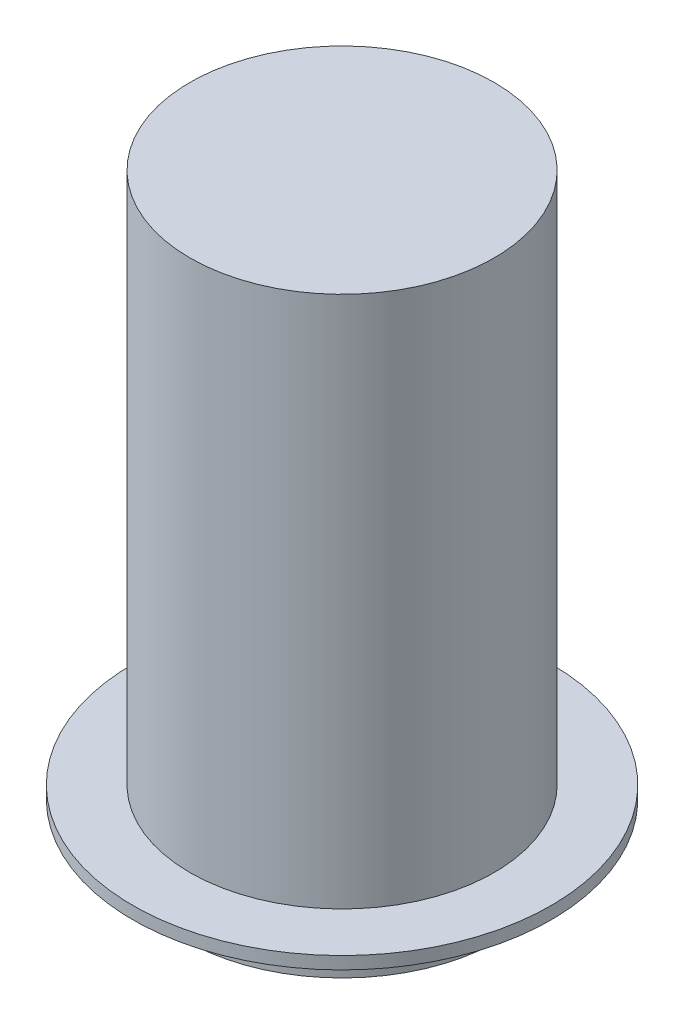
ISO-10303-21;
HEADER;
FILE_DESCRIPTION(('STEP AP214'),'2;1');
FILE_NAME('part.step','',(''),(''),'','','');
FILE_SCHEMA(('AUTOMOTIVE_DESIGN { 1 0 10303 214 1 1 1 1 }'));
ENDSEC;
DATA;
#1=APPLICATION_CONTEXT('core data for automotive mechanical design processes');
#2=APPLICATION_PROTOCOL_DEFINITION('international standard','automotive_design',2000,#1);
#3=PRODUCT_CONTEXT('',#1,'mechanical');
#4=PRODUCT('Part','Part','',(#3));
#5=PRODUCT_RELATED_PRODUCT_CATEGORY('part','',(#4));
#6=PRODUCT_DEFINITION_FORMATION('','',#4);
#7=PRODUCT_DEFINITION_CONTEXT('part definition',#1,'design');
#8=PRODUCT_DEFINITION('design','',#6,#7);
#9=PRODUCT_DEFINITION_SHAPE('','',#8);
#10=(LENGTH_UNIT() NAMED_UNIT(*) SI_UNIT(.MILLI.,.METRE.));
#11=(NAMED_UNIT(*) PLANE_ANGLE_UNIT() SI_UNIT($,.RADIAN.));
#12=(NAMED_UNIT(*) SI_UNIT($,.STERADIAN.) SOLID_ANGLE_UNIT());
#13=UNCERTAINTY_MEASURE_WITH_UNIT(LENGTH_MEASURE(1.E-05),#10,'distance_accuracy_value','');
#14=(GEOMETRIC_REPRESENTATION_CONTEXT(3) GLOBAL_UNCERTAINTY_ASSIGNED_CONTEXT((#13)) GLOBAL_UNIT_ASSIGNED_CONTEXT((#10,
#11,#12)) REPRESENTATION_CONTEXT('',''));
#15=CARTESIAN_POINT('',(0.,0.,0.));
#16=DIRECTION('',(0.,0.,1.));
#17=DIRECTION('',(1.,0.,0.));
#18=AXIS2_PLACEMENT_3D('',#15,#16,#17);
#19=CARTESIAN_POINT('',(0.,35.82,0.));
#20=DIRECTION('',(0.,1.,0.));
#21=DIRECTION('',(0.,0.,1.));
#22=AXIS2_PLACEMENT_3D('',#19,#20,#21);
#23=PLANE('',#22);
#24=CARTESIAN_POINT('',(0.,35.82,0.));
#25=DIRECTION('',(0.,-1.,0.));
#26=DIRECTION('',(0.,0.,-1.));
#27=AXIS2_PLACEMENT_3D('',#24,#25,#26);
#28=CIRCLE('',#27,10.);
#29=CARTESIAN_POINT('',(0.,35.82,-10.));
#30=VERTEX_POINT('',#29);
#31=EDGE_CURVE('E10',#30,#30,#28,.T.);
#32=ORIENTED_EDGE('',*,*,#31,.F.);
#33=EDGE_LOOP('',(#32));
#34=FACE_BOUND('',#33,.T.);
#35=ADVANCED_FACE('F35',(#34),#23,.T.);
#36=CARTESIAN_POINT('',(0.,0.,0.));
#37=DIRECTION('',(0.,-1.,0.));
#38=DIRECTION('',(0.,0.,-1.));
#39=AXIS2_PLACEMENT_3D('',#36,#37,#38);
#40=CYLINDRICAL_SURFACE('',#39,10.);
#41=ORIENTED_EDGE('',*,*,#31,.T.);
#42=EDGE_LOOP('',(#41));
#43=FACE_BOUND('',#42,.T.);
#44=CARTESIAN_POINT('',(0.,0.820000000000001,0.));
#45=DIRECTION('',(0.,-1.,0.));
#46=DIRECTION('',(0.,0.,-1.));
#47=AXIS2_PLACEMENT_3D('',#44,#45,#46);
#48=CIRCLE('',#47,10.);
#49=CARTESIAN_POINT('',(0.,0.820000000000001,-10.));
#50=VERTEX_POINT('',#49);
#51=EDGE_CURVE('E41',#50,#50,#48,.T.);
#52=ORIENTED_EDGE('',*,*,#51,.F.);
#53=EDGE_LOOP('',(#52));
#54=FACE_BOUND('',#53,.T.);
#55=ADVANCED_FACE('F83',(#43,#54),#40,.T.);
#56=CARTESIAN_POINT('',(10.,0.82,0.));
#57=DIRECTION('',(0.,1.,0.));
#58=DIRECTION('',(0.,0.,1.));
#59=AXIS2_PLACEMENT_3D('',#56,#57,#58);
#60=PLANE('',#59);
#61=ORIENTED_EDGE('',*,*,#51,.T.);
#62=EDGE_LOOP('',(#61));
#63=FACE_BOUND('',#62,.T.);
#64=CARTESIAN_POINT('',(0.,0.82,0.));
#65=DIRECTION('',(0.,-1.,0.));
#66=DIRECTION('',(0.,0.,-1.));
#67=AXIS2_PLACEMENT_3D('',#64,#65,#66);
#68=CIRCLE('',#67,13.75);
#69=CARTESIAN_POINT('',(0.,0.82,-13.75));
#70=VERTEX_POINT('',#69);
#71=EDGE_CURVE('E45',#70,#70,#68,.T.);
#72=ORIENTED_EDGE('',*,*,#71,.F.);
#73=EDGE_LOOP('',(#72));
#74=FACE_BOUND('',#73,.T.);
#75=ADVANCED_FACE('F88',(#63,#74),#60,.T.);
#76=CARTESIAN_POINT('',(0.,0.,0.));
#77=DIRECTION('',(0.,-1.,0.));
#78=DIRECTION('',(0.,0.,-1.));
#79=AXIS2_PLACEMENT_3D('',#76,#77,#78);
#80=CYLINDRICAL_SURFACE('',#79,13.75);
#81=ORIENTED_EDGE('',*,*,#71,.T.);
#82=EDGE_LOOP('',(#81));
#83=FACE_BOUND('',#82,.T.);
#84=CARTESIAN_POINT('',(0.,0.,0.));
#85=DIRECTION('',(0.,-1.,0.));
#86=DIRECTION('',(0.,0.,-1.));
#87=AXIS2_PLACEMENT_3D('',#84,#85,#86);
#88=CIRCLE('',#87,13.75);
#89=CARTESIAN_POINT('',(0.,0.,-13.75));
#90=VERTEX_POINT('',#89);
#91=EDGE_CURVE('E49',#90,#90,#88,.T.);
#92=ORIENTED_EDGE('',*,*,#91,.F.);
#93=EDGE_LOOP('',(#92));
#94=FACE_BOUND('',#93,.T.);
#95=ADVANCED_FACE('F92',(#83,#94),#80,.T.);
#96=CARTESIAN_POINT('',(13.75,0.,0.));
#97=DIRECTION('',(0.,-1.,0.));
#98=DIRECTION('',(0.,0.,-1.));
#99=AXIS2_PLACEMENT_3D('',#96,#97,#98);
#100=PLANE('',#99);
#101=ORIENTED_EDGE('',*,*,#91,.T.);
#102=EDGE_LOOP('',(#101));
#103=FACE_BOUND('',#102,.T.);
#104=CARTESIAN_POINT('',(0.,0.,0.));
#105=DIRECTION('',(0.,-1.,0.));
#106=DIRECTION('',(0.,0.,-1.));
#107=AXIS2_PLACEMENT_3D('',#104,#105,#106);
#108=CIRCLE('',#107,10.325);
#109=CARTESIAN_POINT('',(0.,0.,-10.325));
#110=VERTEX_POINT('',#109);
#111=EDGE_CURVE('E54',#110,#110,#108,.T.);
#112=ORIENTED_EDGE('',*,*,#111,.F.);
#113=EDGE_LOOP('',(#112));
#114=FACE_BOUND('',#113,.T.);
#115=ADVANCED_FACE('F98',(#103,#114),#100,.T.);
#116=CARTESIAN_POINT('',(0.,0.,0.));
#117=DIRECTION('',(0.,-1.,0.));
#118=DIRECTION('',(0.,0.,-1.));
#119=AXIS2_PLACEMENT_3D('',#116,#117,#118);
#120=CYLINDRICAL_SURFACE('',#119,10.325);
#121=ORIENTED_EDGE('',*,*,#111,.T.);
#122=EDGE_LOOP('',(#121));
#123=FACE_BOUND('',#122,.T.);
#124=CARTESIAN_POINT('',(0.,-2.88,0.));
#125=DIRECTION('',(0.,-1.,0.));
#126=DIRECTION('',(0.,0.,-1.));
#127=AXIS2_PLACEMENT_3D('',#124,#125,#126);
#128=CIRCLE('',#127,10.325);
#129=CARTESIAN_POINT('',(0.,-2.88,-10.325));
#130=VERTEX_POINT('',#129);
#131=EDGE_CURVE('E57',#130,#130,#128,.T.);
#132=ORIENTED_EDGE('',*,*,#131,.F.);
#133=EDGE_LOOP('',(#132));
#134=FACE_BOUND('',#133,.T.);
#135=ADVANCED_FACE('F79',(#123,#134),#120,.T.);
#136=CARTESIAN_POINT('',(10.325,-2.88,0.));
#137=DIRECTION('',(0.,-1.,0.));
#138=DIRECTION('',(0.,0.,-1.));
#139=AXIS2_PLACEMENT_3D('',#136,#137,#138);
#140=PLANE('',#139);
#141=ORIENTED_EDGE('',*,*,#131,.T.);
#142=EDGE_LOOP('',(#141));
#143=FACE_BOUND('',#142,.T.);
#144=CARTESIAN_POINT('',(0.,-2.88,0.));
#145=DIRECTION('',(0.,-1.,0.));
#146=DIRECTION('',(0.,0.,-1.));
#147=AXIS2_PLACEMENT_3D('',#144,#145,#146);
#148=CIRCLE('',#147,2.);
#149=CARTESIAN_POINT('',(0.,-2.88,-2.));
#150=VERTEX_POINT('',#149);
#151=EDGE_CURVE('E60',#150,#150,#148,.T.);
#152=ORIENTED_EDGE('',*,*,#151,.F.);
#153=EDGE_LOOP('',(#152));
#154=FACE_BOUND('',#153,.T.);
#155=ADVANCED_FACE('F71',(#143,#154),#140,.T.);
#156=CARTESIAN_POINT('',(0.,0.,0.));
#157=DIRECTION('',(0.,-1.,0.));
#158=DIRECTION('',(0.,0.,-1.));
#159=AXIS2_PLACEMENT_3D('',#156,#157,#158);
#160=CYLINDRICAL_SURFACE('',#159,2.);
#161=ORIENTED_EDGE('',*,*,#151,.T.);
#162=EDGE_LOOP('',(#161));
#163=FACE_BOUND('',#162,.T.);
#164=CARTESIAN_POINT('',(0.,-6.9948,0.));
#165=DIRECTION('',(0.,-1.,0.));
#166=DIRECTION('',(0.,0.,-1.));
#167=AXIS2_PLACEMENT_3D('',#164,#165,#166);
#168=CIRCLE('',#167,2.);
#169=CARTESIAN_POINT('',(0.,-6.9948,-2.));
#170=VERTEX_POINT('',#169);
#171=EDGE_CURVE('E63',#170,#170,#168,.T.);
#172=ORIENTED_EDGE('',*,*,#171,.F.);
#173=EDGE_LOOP('',(#172));
#174=FACE_BOUND('',#173,.T.);
#175=ADVANCED_FACE('F69',(#163,#174),#160,.T.);
#176=CARTESIAN_POINT('',(2.,-6.9948,0.));
#177=DIRECTION('',(0.,-1.,0.));
#178=DIRECTION('',(0.,0.,-1.));
#179=AXIS2_PLACEMENT_3D('',#176,#177,#178);
#180=PLANE('',#179);
#181=ORIENTED_EDGE('',*,*,#171,.T.);
#182=EDGE_LOOP('',(#181));
#183=FACE_BOUND('',#182,.T.);
#184=ADVANCED_FACE('F67',(#183),#180,.T.);
#185=CLOSED_SHELL('',(#35,#55,#75,#95,#115,#135,#155,#175,#184));
#186=MANIFOLD_SOLID_BREP('B2',#185);
#187=ADVANCED_BREP_SHAPE_REPRESENTATION('',(#18,#186),#14);
#188=SHAPE_DEFINITION_REPRESENTATION(#9,#187);
ENDSEC;
END-ISO-10303-21;
